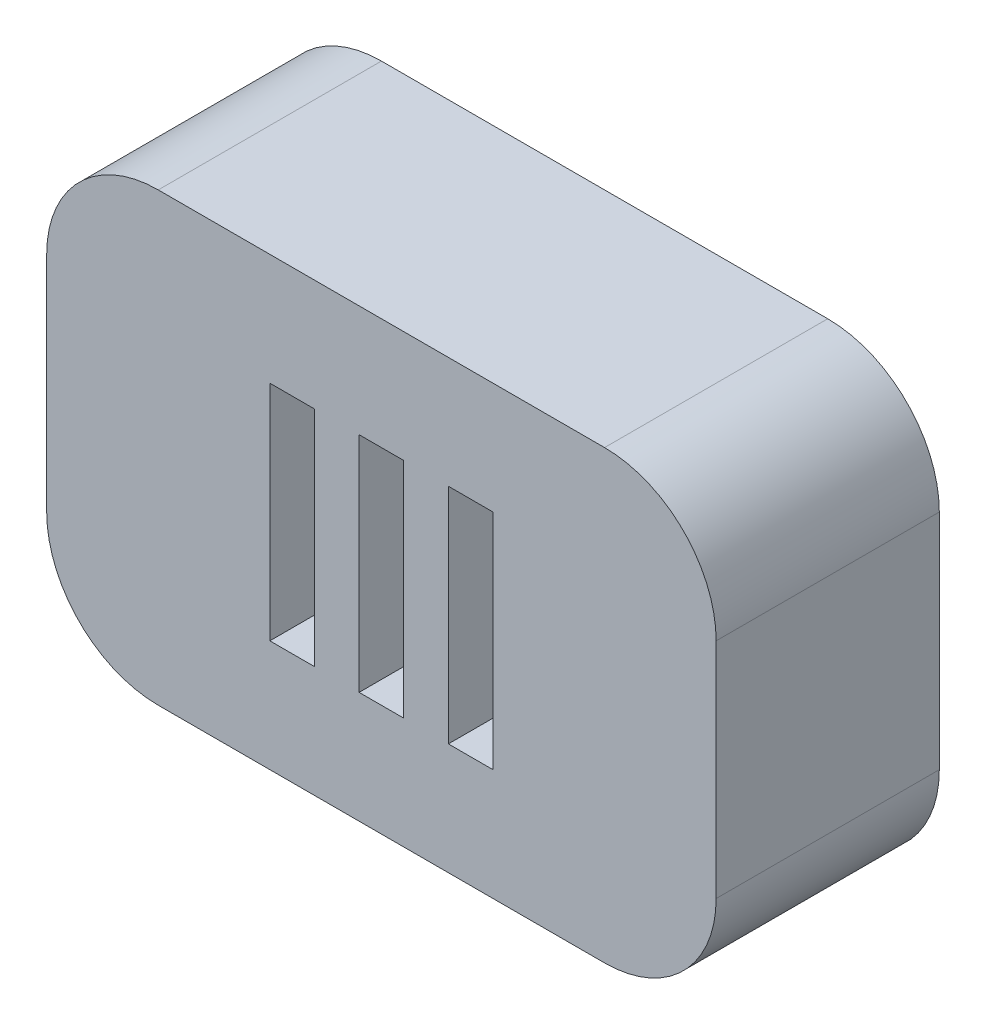
ISO-10303-21;
HEADER;
FILE_DESCRIPTION(('STEP AP214'),'2;1');
FILE_NAME('part.step','',(''),(''),'','','');
FILE_SCHEMA(('AUTOMOTIVE_DESIGN { 1 0 10303 214 1 1 1 1 }'));
ENDSEC;
DATA;
#1=APPLICATION_CONTEXT('core data for automotive mechanical design processes');
#2=APPLICATION_PROTOCOL_DEFINITION('international standard','automotive_design',2000,#1);
#3=PRODUCT_CONTEXT('',#1,'mechanical');
#4=PRODUCT('Part','Part','',(#3));
#5=PRODUCT_RELATED_PRODUCT_CATEGORY('part','',(#4));
#6=PRODUCT_DEFINITION_FORMATION('','',#4);
#7=PRODUCT_DEFINITION_CONTEXT('part definition',#1,'design');
#8=PRODUCT_DEFINITION('design','',#6,#7);
#9=PRODUCT_DEFINITION_SHAPE('','',#8);
#10=(LENGTH_UNIT() NAMED_UNIT(*) SI_UNIT(.MILLI.,.METRE.));
#11=(NAMED_UNIT(*) PLANE_ANGLE_UNIT() SI_UNIT($,.RADIAN.));
#12=(NAMED_UNIT(*) SI_UNIT($,.STERADIAN.) SOLID_ANGLE_UNIT());
#13=UNCERTAINTY_MEASURE_WITH_UNIT(LENGTH_MEASURE(1.E-05),#10,'distance_accuracy_value','');
#14=(GEOMETRIC_REPRESENTATION_CONTEXT(3) GLOBAL_UNCERTAINTY_ASSIGNED_CONTEXT((#13)) GLOBAL_UNIT_ASSIGNED_CONTEXT((#10,
#11,#12)) REPRESENTATION_CONTEXT('',''));
#15=CARTESIAN_POINT('',(0.,0.,0.));
#16=DIRECTION('',(0.,0.,1.));
#17=DIRECTION('',(1.,0.,0.));
#18=AXIS2_PLACEMENT_3D('',#15,#16,#17);
#19=CARTESIAN_POINT('',(1.,1.,2.));
#20=DIRECTION('',(0.,0.,-1.));
#21=DIRECTION('',(-1.,0.,0.));
#22=AXIS2_PLACEMENT_3D('',#19,#20,#21);
#23=CYLINDRICAL_SURFACE('',#22,1.);
#24=CARTESIAN_POINT('',(1.,1.,0.));
#25=DIRECTION('',(0.,0.,1.));
#26=DIRECTION('',(1.,0.,0.));
#27=AXIS2_PLACEMENT_3D('',#24,#25,#26);
#28=CIRCLE('',#27,1.);
#29=CARTESIAN_POINT('',(0.,1.00000000000001,0.));
#30=VERTEX_POINT('',#29);
#31=CARTESIAN_POINT('',(1.00000000000001,0.,0.));
#32=VERTEX_POINT('',#31);
#33=EDGE_CURVE('E302',#30,#32,#28,.T.);
#34=ORIENTED_EDGE('',*,*,#33,.T.);
#35=DIRECTION('',(0.,0.,-1.));
#36=VECTOR('',#35,1.);
#37=CARTESIAN_POINT('',(1.00000000000001,0.,2.));
#38=LINE('',#37,#36);
#39=CARTESIAN_POINT('',(1.00000000000001,0.,2.));
#40=VERTEX_POINT('',#39);
#41=EDGE_CURVE('E11',#40,#32,#38,.T.);
#42=ORIENTED_EDGE('',*,*,#41,.F.);
#43=CARTESIAN_POINT('',(1.,1.,2.));
#44=DIRECTION('',(0.,0.,1.));
#45=DIRECTION('',(1.,0.,0.));
#46=AXIS2_PLACEMENT_3D('',#43,#44,#45);
#47=CIRCLE('',#46,1.);
#48=CARTESIAN_POINT('',(0.,1.00000000000001,2.));
#49=VERTEX_POINT('',#48);
#50=EDGE_CURVE('E312',#49,#40,#47,.T.);
#51=ORIENTED_EDGE('',*,*,#50,.F.);
#52=DIRECTION('',(0.,0.,-1.));
#53=VECTOR('',#52,1.);
#54=CARTESIAN_POINT('',(0.,1.00000000000001,2.));
#55=LINE('',#54,#53);
#56=EDGE_CURVE('E338',#49,#30,#55,.T.);
#57=ORIENTED_EDGE('',*,*,#56,.T.);
#58=EDGE_LOOP('',(#34,#42,#51,#57));
#59=FACE_BOUND('',#58,.T.);
#60=ADVANCED_FACE('F38',(#59),#23,.T.);
#61=CARTESIAN_POINT('',(1.00000000000001,0.,2.));
#62=DIRECTION('',(0.,1.,0.));
#63=DIRECTION('',(0.,0.,1.));
#64=AXIS2_PLACEMENT_3D('',#61,#62,#63);
#65=PLANE('',#64);
#66=DIRECTION('',(1.,0.,0.));
#67=VECTOR('',#66,1.);
#68=CARTESIAN_POINT('',(1.00000000000001,0.,0.));
#69=LINE('',#68,#67);
#70=CARTESIAN_POINT('',(5.,0.,0.));
#71=VERTEX_POINT('',#70);
#72=EDGE_CURVE('E342',#32,#71,#69,.T.);
#73=ORIENTED_EDGE('',*,*,#72,.T.);
#74=DIRECTION('',(0.,0.,-1.));
#75=VECTOR('',#74,1.);
#76=CARTESIAN_POINT('',(5.,0.,2.));
#77=LINE('',#76,#75);
#78=CARTESIAN_POINT('',(5.,0.,2.));
#79=VERTEX_POINT('',#78);
#80=EDGE_CURVE('E46',#79,#71,#77,.T.);
#81=ORIENTED_EDGE('',*,*,#80,.F.);
#82=DIRECTION('',(1.,0.,0.));
#83=VECTOR('',#82,1.);
#84=CARTESIAN_POINT('',(1.00000000000001,0.,2.));
#85=LINE('',#84,#83);
#86=EDGE_CURVE('E316',#40,#79,#85,.T.);
#87=ORIENTED_EDGE('',*,*,#86,.F.);
#88=ORIENTED_EDGE('',*,*,#41,.T.);
#89=EDGE_LOOP('',(#73,#81,#87,#88));
#90=FACE_BOUND('',#89,.T.);
#91=ADVANCED_FACE('F413',(#90),#65,.F.);
#92=CARTESIAN_POINT('',(5.,1.,2.));
#93=DIRECTION('',(0.,0.,-1.));
#94=DIRECTION('',(-1.,0.,0.));
#95=AXIS2_PLACEMENT_3D('',#92,#93,#94);
#96=CYLINDRICAL_SURFACE('',#95,1.);
#97=CARTESIAN_POINT('',(5.,1.,0.));
#98=DIRECTION('',(0.,0.,1.));
#99=DIRECTION('',(1.,0.,0.));
#100=AXIS2_PLACEMENT_3D('',#97,#98,#99);
#101=CIRCLE('',#100,1.);
#102=CARTESIAN_POINT('',(6.,1.,0.));
#103=VERTEX_POINT('',#102);
#104=EDGE_CURVE('E345',#71,#103,#101,.T.);
#105=ORIENTED_EDGE('',*,*,#104,.T.);
#106=DIRECTION('',(0.,0.,-1.));
#107=VECTOR('',#106,1.);
#108=CARTESIAN_POINT('',(6.,1.,2.));
#109=LINE('',#108,#107);
#110=CARTESIAN_POINT('',(6.,1.,2.));
#111=VERTEX_POINT('',#110);
#112=EDGE_CURVE('E381',#111,#103,#109,.T.);
#113=ORIENTED_EDGE('',*,*,#112,.F.);
#114=CARTESIAN_POINT('',(5.,1.,2.));
#115=DIRECTION('',(0.,0.,1.));
#116=DIRECTION('',(1.,0.,0.));
#117=AXIS2_PLACEMENT_3D('',#114,#115,#116);
#118=CIRCLE('',#117,1.);
#119=EDGE_CURVE('E320',#79,#111,#118,.T.);
#120=ORIENTED_EDGE('',*,*,#119,.F.);
#121=ORIENTED_EDGE('',*,*,#80,.T.);
#122=EDGE_LOOP('',(#105,#113,#120,#121));
#123=FACE_BOUND('',#122,.T.);
#124=ADVANCED_FACE('F390',(#123),#96,.T.);
#125=CARTESIAN_POINT('',(6.,1.,2.));
#126=DIRECTION('',(-1.,0.,0.));
#127=DIRECTION('',(0.,0.,1.));
#128=AXIS2_PLACEMENT_3D('',#125,#126,#127);
#129=PLANE('',#128);
#130=DIRECTION('',(0.,1.,0.));
#131=VECTOR('',#130,1.);
#132=CARTESIAN_POINT('',(6.,1.,0.));
#133=LINE('',#132,#131);
#134=CARTESIAN_POINT('',(6.,3.,0.));
#135=VERTEX_POINT('',#134);
#136=EDGE_CURVE('E348',#103,#135,#133,.T.);
#137=ORIENTED_EDGE('',*,*,#136,.T.);
#138=DIRECTION('',(0.,0.,-1.));
#139=VECTOR('',#138,1.);
#140=CARTESIAN_POINT('',(6.,3.,2.));
#141=LINE('',#140,#139);
#142=CARTESIAN_POINT('',(6.,3.,2.));
#143=VERTEX_POINT('',#142);
#144=EDGE_CURVE('E377',#143,#135,#141,.T.);
#145=ORIENTED_EDGE('',*,*,#144,.F.);
#146=DIRECTION('',(0.,1.,0.));
#147=VECTOR('',#146,1.);
#148=CARTESIAN_POINT('',(6.,1.,2.));
#149=LINE('',#148,#147);
#150=EDGE_CURVE('E323',#111,#143,#149,.T.);
#151=ORIENTED_EDGE('',*,*,#150,.F.);
#152=ORIENTED_EDGE('',*,*,#112,.T.);
#153=EDGE_LOOP('',(#137,#145,#151,#152));
#154=FACE_BOUND('',#153,.T.);
#155=ADVANCED_FACE('F401',(#154),#129,.F.);
#156=CARTESIAN_POINT('',(5.,3.,2.));
#157=DIRECTION('',(0.,0.,-1.));
#158=DIRECTION('',(-1.,0.,0.));
#159=AXIS2_PLACEMENT_3D('',#156,#157,#158);
#160=CYLINDRICAL_SURFACE('',#159,1.);
#161=CARTESIAN_POINT('',(5.,3.,0.));
#162=DIRECTION('',(0.,0.,1.));
#163=DIRECTION('',(1.,0.,0.));
#164=AXIS2_PLACEMENT_3D('',#161,#162,#163);
#165=CIRCLE('',#164,1.);
#166=CARTESIAN_POINT('',(5.,4.,0.));
#167=VERTEX_POINT('',#166);
#168=EDGE_CURVE('E351',#135,#167,#165,.T.);
#169=ORIENTED_EDGE('',*,*,#168,.T.);
#170=DIRECTION('',(0.,0.,-1.));
#171=VECTOR('',#170,1.);
#172=CARTESIAN_POINT('',(5.,4.,2.));
#173=LINE('',#172,#171);
#174=CARTESIAN_POINT('',(5.,4.,2.));
#175=VERTEX_POINT('',#174);
#176=EDGE_CURVE('E373',#175,#167,#173,.T.);
#177=ORIENTED_EDGE('',*,*,#176,.F.);
#178=CARTESIAN_POINT('',(5.,3.,2.));
#179=DIRECTION('',(0.,0.,1.));
#180=DIRECTION('',(1.,0.,0.));
#181=AXIS2_PLACEMENT_3D('',#178,#179,#180);
#182=CIRCLE('',#181,1.);
#183=EDGE_CURVE('E326',#143,#175,#182,.T.);
#184=ORIENTED_EDGE('',*,*,#183,.F.);
#185=ORIENTED_EDGE('',*,*,#144,.T.);
#186=EDGE_LOOP('',(#169,#177,#184,#185));
#187=FACE_BOUND('',#186,.T.);
#188=ADVANCED_FACE('F405',(#187),#160,.T.);
#189=CARTESIAN_POINT('',(1.00000000000001,4.,2.));
#190=DIRECTION('',(0.,-1.,0.));
#191=DIRECTION('',(0.,0.,-1.));
#192=AXIS2_PLACEMENT_3D('',#189,#190,#191);
#193=PLANE('',#192);
#194=DIRECTION('',(-1.,0.,0.));
#195=VECTOR('',#194,1.);
#196=CARTESIAN_POINT('',(1.00000000000001,4.,0.));
#197=LINE('',#196,#195);
#198=CARTESIAN_POINT('',(1.00000000000001,4.,0.));
#199=VERTEX_POINT('',#198);
#200=EDGE_CURVE('E354',#167,#199,#197,.T.);
#201=ORIENTED_EDGE('',*,*,#200,.T.);
#202=DIRECTION('',(0.,0.,-1.));
#203=VECTOR('',#202,1.);
#204=CARTESIAN_POINT('',(1.00000000000001,4.,2.));
#205=LINE('',#204,#203);
#206=CARTESIAN_POINT('',(1.00000000000001,4.,2.));
#207=VERTEX_POINT('',#206);
#208=EDGE_CURVE('E369',#207,#199,#205,.T.);
#209=ORIENTED_EDGE('',*,*,#208,.F.);
#210=DIRECTION('',(-1.,0.,0.));
#211=VECTOR('',#210,1.);
#212=CARTESIAN_POINT('',(1.00000000000001,4.,2.));
#213=LINE('',#212,#211);
#214=EDGE_CURVE('E329',#175,#207,#213,.T.);
#215=ORIENTED_EDGE('',*,*,#214,.F.);
#216=ORIENTED_EDGE('',*,*,#176,.T.);
#217=EDGE_LOOP('',(#201,#209,#215,#216));
#218=FACE_BOUND('',#217,.T.);
#219=ADVANCED_FACE('F426',(#218),#193,.F.);
#220=CARTESIAN_POINT('',(1.,3.,2.));
#221=DIRECTION('',(0.,0.,-1.));
#222=DIRECTION('',(-1.,0.,0.));
#223=AXIS2_PLACEMENT_3D('',#220,#221,#222);
#224=CYLINDRICAL_SURFACE('',#223,1.);
#225=CARTESIAN_POINT('',(1.,3.,0.));
#226=DIRECTION('',(0.,0.,1.));
#227=DIRECTION('',(1.,0.,0.));
#228=AXIS2_PLACEMENT_3D('',#225,#226,#227);
#229=CIRCLE('',#228,1.);
#230=CARTESIAN_POINT('',(0.,2.99999999999999,0.));
#231=VERTEX_POINT('',#230);
#232=EDGE_CURVE('E357',#199,#231,#229,.T.);
#233=ORIENTED_EDGE('',*,*,#232,.T.);
#234=DIRECTION('',(0.,0.,-1.));
#235=VECTOR('',#234,1.);
#236=CARTESIAN_POINT('',(0.,2.99999999999999,2.));
#237=LINE('',#236,#235);
#238=CARTESIAN_POINT('',(0.,2.99999999999999,2.));
#239=VERTEX_POINT('',#238);
#240=EDGE_CURVE('E365',#239,#231,#237,.T.);
#241=ORIENTED_EDGE('',*,*,#240,.F.);
#242=CARTESIAN_POINT('',(1.,3.,2.));
#243=DIRECTION('',(0.,0.,1.));
#244=DIRECTION('',(1.,0.,0.));
#245=AXIS2_PLACEMENT_3D('',#242,#243,#244);
#246=CIRCLE('',#245,1.);
#247=EDGE_CURVE('E332',#207,#239,#246,.T.);
#248=ORIENTED_EDGE('',*,*,#247,.F.);
#249=ORIENTED_EDGE('',*,*,#208,.T.);
#250=EDGE_LOOP('',(#233,#241,#248,#249));
#251=FACE_BOUND('',#250,.T.);
#252=ADVANCED_FACE('F424',(#251),#224,.T.);
#253=CARTESIAN_POINT('',(0.,1.00000000000001,2.));
#254=DIRECTION('',(1.,0.,0.));
#255=DIRECTION('',(0.,0.,-1.));
#256=AXIS2_PLACEMENT_3D('',#253,#254,#255);
#257=PLANE('',#256);
#258=DIRECTION('',(0.,-1.,0.));
#259=VECTOR('',#258,1.);
#260=CARTESIAN_POINT('',(0.,1.00000000000001,0.));
#261=LINE('',#260,#259);
#262=EDGE_CURVE('E317',#231,#30,#261,.T.);
#263=ORIENTED_EDGE('',*,*,#262,.T.);
#264=ORIENTED_EDGE('',*,*,#56,.F.);
#265=DIRECTION('',(0.,-1.,0.));
#266=VECTOR('',#265,1.);
#267=CARTESIAN_POINT('',(0.,1.00000000000001,2.));
#268=LINE('',#267,#266);
#269=EDGE_CURVE('E335',#239,#49,#268,.T.);
#270=ORIENTED_EDGE('',*,*,#269,.F.);
#271=ORIENTED_EDGE('',*,*,#240,.T.);
#272=EDGE_LOOP('',(#263,#264,#270,#271));
#273=FACE_BOUND('',#272,.T.);
#274=ADVANCED_FACE('F419',(#273),#257,.F.);
#275=CARTESIAN_POINT('',(1.,1.,2.));
#276=DIRECTION('',(0.,0.,1.));
#277=DIRECTION('',(1.,0.,0.));
#278=AXIS2_PLACEMENT_3D('',#275,#276,#277);
#279=PLANE('',#278);
#280=DIRECTION('',(0.,1.,0.));
#281=VECTOR('',#280,1.);
#282=CARTESIAN_POINT('',(2.4,3.,2.));
#283=LINE('',#282,#281);
#284=CARTESIAN_POINT('',(2.4,1.,2.));
#285=VERTEX_POINT('',#284);
#286=CARTESIAN_POINT('',(2.4,3.,2.));
#287=VERTEX_POINT('',#286);
#288=EDGE_CURVE('E53',#285,#287,#283,.T.);
#289=ORIENTED_EDGE('',*,*,#288,.F.);
#290=DIRECTION('',(1.,0.,0.));
#291=VECTOR('',#290,1.);
#292=CARTESIAN_POINT('',(2.4,1.,2.));
#293=LINE('',#292,#291);
#294=CARTESIAN_POINT('',(2.,1.,2.));
#295=VERTEX_POINT('',#294);
#296=EDGE_CURVE('E198',#295,#285,#293,.T.);
#297=ORIENTED_EDGE('',*,*,#296,.F.);
#298=DIRECTION('',(0.,-1.,0.));
#299=VECTOR('',#298,1.);
#300=CARTESIAN_POINT('',(2.,3.,2.));
#301=LINE('',#300,#299);
#302=CARTESIAN_POINT('',(2.,3.,2.));
#303=VERTEX_POINT('',#302);
#304=EDGE_CURVE('E202',#303,#295,#301,.T.);
#305=ORIENTED_EDGE('',*,*,#304,.F.);
#306=DIRECTION('',(-1.,0.,0.));
#307=VECTOR('',#306,1.);
#308=CARTESIAN_POINT('',(2.4,3.,2.));
#309=LINE('',#308,#307);
#310=EDGE_CURVE('E211',#287,#303,#309,.T.);
#311=ORIENTED_EDGE('',*,*,#310,.F.);
#312=EDGE_LOOP('',(#289,#297,#305,#311));
#313=FACE_BOUND('',#312,.T.);
#314=DIRECTION('',(0.,-1.,0.));
#315=VECTOR('',#314,1.);
#316=CARTESIAN_POINT('',(3.6,3.,2.));
#317=LINE('',#316,#315);
#318=CARTESIAN_POINT('',(3.6,3.,2.));
#319=VERTEX_POINT('',#318);
#320=CARTESIAN_POINT('',(3.6,1.,2.));
#321=VERTEX_POINT('',#320);
#322=EDGE_CURVE('E61',#319,#321,#317,.T.);
#323=ORIENTED_EDGE('',*,*,#322,.F.);
#324=DIRECTION('',(-1.,0.,0.));
#325=VECTOR('',#324,1.);
#326=CARTESIAN_POINT('',(3.6,3.,2.));
#327=LINE('',#326,#325);
#328=CARTESIAN_POINT('',(4.,3.,2.));
#329=VERTEX_POINT('',#328);
#330=EDGE_CURVE('E230',#329,#319,#327,.T.);
#331=ORIENTED_EDGE('',*,*,#330,.F.);
#332=DIRECTION('',(0.,1.,0.));
#333=VECTOR('',#332,1.);
#334=CARTESIAN_POINT('',(4.,3.,2.));
#335=LINE('',#334,#333);
#336=CARTESIAN_POINT('',(4.,1.,2.));
#337=VERTEX_POINT('',#336);
#338=EDGE_CURVE('E249',#337,#329,#335,.T.);
#339=ORIENTED_EDGE('',*,*,#338,.F.);
#340=DIRECTION('',(1.,0.,0.));
#341=VECTOR('',#340,1.);
#342=CARTESIAN_POINT('',(3.6,1.,2.));
#343=LINE('',#342,#341);
#344=EDGE_CURVE('E245',#321,#337,#343,.T.);
#345=ORIENTED_EDGE('',*,*,#344,.F.);
#346=EDGE_LOOP('',(#323,#331,#339,#345));
#347=FACE_BOUND('',#346,.T.);
#348=DIRECTION('',(0.,-1.,0.));
#349=VECTOR('',#348,1.);
#350=CARTESIAN_POINT('',(2.8,3.,2.));
#351=LINE('',#350,#349);
#352=CARTESIAN_POINT('',(2.8,3.,2.));
#353=VERTEX_POINT('',#352);
#354=CARTESIAN_POINT('',(2.8,1.,2.));
#355=VERTEX_POINT('',#354);
#356=EDGE_CURVE('E259',#353,#355,#351,.T.);
#357=ORIENTED_EDGE('',*,*,#356,.F.);
#358=DIRECTION('',(-1.,0.,0.));
#359=VECTOR('',#358,1.);
#360=CARTESIAN_POINT('',(2.8,3.,2.));
#361=LINE('',#360,#359);
#362=CARTESIAN_POINT('',(3.2,3.,2.));
#363=VERTEX_POINT('',#362);
#364=EDGE_CURVE('E273',#363,#353,#361,.T.);
#365=ORIENTED_EDGE('',*,*,#364,.F.);
#366=DIRECTION('',(0.,1.,0.));
#367=VECTOR('',#366,1.);
#368=CARTESIAN_POINT('',(3.2,3.,2.));
#369=LINE('',#368,#367);
#370=CARTESIAN_POINT('',(3.2,1.,2.));
#371=VERTEX_POINT('',#370);
#372=EDGE_CURVE('E292',#371,#363,#369,.T.);
#373=ORIENTED_EDGE('',*,*,#372,.F.);
#374=DIRECTION('',(1.,0.,0.));
#375=VECTOR('',#374,1.);
#376=CARTESIAN_POINT('',(2.8,1.,2.));
#377=LINE('',#376,#375);
#378=EDGE_CURVE('E288',#355,#371,#377,.T.);
#379=ORIENTED_EDGE('',*,*,#378,.F.);
#380=EDGE_LOOP('',(#357,#365,#373,#379));
#381=FACE_BOUND('',#380,.T.);
#382=ORIENTED_EDGE('',*,*,#50,.T.);
#383=ORIENTED_EDGE('',*,*,#86,.T.);
#384=ORIENTED_EDGE('',*,*,#119,.T.);
#385=ORIENTED_EDGE('',*,*,#150,.T.);
#386=ORIENTED_EDGE('',*,*,#183,.T.);
#387=ORIENTED_EDGE('',*,*,#214,.T.);
#388=ORIENTED_EDGE('',*,*,#247,.T.);
#389=ORIENTED_EDGE('',*,*,#269,.T.);
#390=EDGE_LOOP('',(#382,#383,#384,#385,#386,#387,#388,#389));
#391=FACE_BOUND('',#390,.T.);
#392=ADVANCED_FACE('F409',(#313,#347,#381,#391),#279,.T.);
#393=CARTESIAN_POINT('',(1.,1.,0.));
#394=DIRECTION('',(0.,0.,1.));
#395=DIRECTION('',(1.,0.,0.));
#396=AXIS2_PLACEMENT_3D('',#393,#394,#395);
#397=PLANE('',#396);
#398=ORIENTED_EDGE('',*,*,#33,.F.);
#399=ORIENTED_EDGE('',*,*,#262,.F.);
#400=ORIENTED_EDGE('',*,*,#232,.F.);
#401=ORIENTED_EDGE('',*,*,#200,.F.);
#402=ORIENTED_EDGE('',*,*,#168,.F.);
#403=ORIENTED_EDGE('',*,*,#136,.F.);
#404=ORIENTED_EDGE('',*,*,#104,.F.);
#405=ORIENTED_EDGE('',*,*,#72,.F.);
#406=EDGE_LOOP('',(#398,#399,#400,#401,#402,#403,#404,#405));
#407=FACE_BOUND('',#406,.T.);
#408=ADVANCED_FACE('F396',(#407),#397,.F.);
#409=CARTESIAN_POINT('',(2.8,3.,1.));
#410=DIRECTION('',(-1.,0.,0.));
#411=DIRECTION('',(0.,-1.,0.));
#412=AXIS2_PLACEMENT_3D('',#409,#410,#411);
#413=PLANE('',#412);
#414=ORIENTED_EDGE('',*,*,#356,.T.);
#415=DIRECTION('',(0.,0.,1.));
#416=VECTOR('',#415,1.);
#417=CARTESIAN_POINT('',(2.8,1.,1.));
#418=LINE('',#417,#416);
#419=CARTESIAN_POINT('',(2.8,1.,1.));
#420=VERTEX_POINT('',#419);
#421=EDGE_CURVE('E285',#420,#355,#418,.T.);
#422=ORIENTED_EDGE('',*,*,#421,.F.);
#423=DIRECTION('',(0.,-1.,0.));
#424=VECTOR('',#423,1.);
#425=CARTESIAN_POINT('',(2.8,3.,1.));
#426=LINE('',#425,#424);
#427=CARTESIAN_POINT('',(2.8,3.,1.));
#428=VERTEX_POINT('',#427);
#429=EDGE_CURVE('E268',#428,#420,#426,.T.);
#430=ORIENTED_EDGE('',*,*,#429,.F.);
#431=DIRECTION('',(0.,0.,1.));
#432=VECTOR('',#431,1.);
#433=CARTESIAN_POINT('',(2.8,3.,1.));
#434=LINE('',#433,#432);
#435=EDGE_CURVE('E299',#428,#353,#434,.T.);
#436=ORIENTED_EDGE('',*,*,#435,.T.);
#437=EDGE_LOOP('',(#414,#422,#430,#436));
#438=FACE_BOUND('',#437,.T.);
#439=ADVANCED_FACE('F482',(#438),#413,.F.);
#440=CARTESIAN_POINT('',(2.8,3.,1.));
#441=DIRECTION('',(0.,1.,0.));
#442=DIRECTION('',(0.,0.,1.));
#443=AXIS2_PLACEMENT_3D('',#440,#441,#442);
#444=PLANE('',#443);
#445=ORIENTED_EDGE('',*,*,#364,.T.);
#446=ORIENTED_EDGE('',*,*,#435,.F.);
#447=DIRECTION('',(-1.,0.,0.));
#448=VECTOR('',#447,1.);
#449=CARTESIAN_POINT('',(2.8,3.,1.));
#450=LINE('',#449,#448);
#451=CARTESIAN_POINT('',(3.2,3.,1.));
#452=VERTEX_POINT('',#451);
#453=EDGE_CURVE('E281',#452,#428,#450,.T.);
#454=ORIENTED_EDGE('',*,*,#453,.F.);
#455=DIRECTION('',(0.,0.,1.));
#456=VECTOR('',#455,1.);
#457=CARTESIAN_POINT('',(3.2,3.,1.));
#458=LINE('',#457,#456);
#459=EDGE_CURVE('E303',#452,#363,#458,.T.);
#460=ORIENTED_EDGE('',*,*,#459,.T.);
#461=EDGE_LOOP('',(#445,#446,#454,#460));
#462=FACE_BOUND('',#461,.T.);
#463=ADVANCED_FACE('F491',(#462),#444,.F.);
#464=CARTESIAN_POINT('',(3.2,3.,1.));
#465=DIRECTION('',(1.,0.,0.));
#466=DIRECTION('',(0.,1.,0.));
#467=AXIS2_PLACEMENT_3D('',#464,#465,#466);
#468=PLANE('',#467);
#469=ORIENTED_EDGE('',*,*,#372,.T.);
#470=ORIENTED_EDGE('',*,*,#459,.F.);
#471=DIRECTION('',(0.,1.,0.));
#472=VECTOR('',#471,1.);
#473=CARTESIAN_POINT('',(3.2,3.,1.));
#474=LINE('',#473,#472);
#475=CARTESIAN_POINT('',(3.2,1.,1.));
#476=VERTEX_POINT('',#475);
#477=EDGE_CURVE('E277',#476,#452,#474,.T.);
#478=ORIENTED_EDGE('',*,*,#477,.F.);
#479=DIRECTION('',(0.,0.,1.));
#480=VECTOR('',#479,1.);
#481=CARTESIAN_POINT('',(3.2,1.,1.));
#482=LINE('',#481,#480);
#483=EDGE_CURVE('E306',#476,#371,#482,.T.);
#484=ORIENTED_EDGE('',*,*,#483,.T.);
#485=EDGE_LOOP('',(#469,#470,#478,#484));
#486=FACE_BOUND('',#485,.T.);
#487=ADVANCED_FACE('F501',(#486),#468,.F.);
#488=CARTESIAN_POINT('',(2.8,1.,1.));
#489=DIRECTION('',(0.,-1.,0.));
#490=DIRECTION('',(0.,0.,-1.));
#491=AXIS2_PLACEMENT_3D('',#488,#489,#490);
#492=PLANE('',#491);
#493=ORIENTED_EDGE('',*,*,#378,.T.);
#494=ORIENTED_EDGE('',*,*,#483,.F.);
#495=DIRECTION('',(1.,0.,0.));
#496=VECTOR('',#495,1.);
#497=CARTESIAN_POINT('',(2.8,1.,1.));
#498=LINE('',#497,#496);
#499=EDGE_CURVE('E272',#420,#476,#498,.T.);
#500=ORIENTED_EDGE('',*,*,#499,.F.);
#501=ORIENTED_EDGE('',*,*,#421,.T.);
#502=EDGE_LOOP('',(#493,#494,#500,#501));
#503=FACE_BOUND('',#502,.T.);
#504=ADVANCED_FACE('F511',(#503),#492,.F.);
#505=CARTESIAN_POINT('',(0.,0.,1.));
#506=DIRECTION('',(0.,0.,1.));
#507=DIRECTION('',(1.,0.,0.));
#508=AXIS2_PLACEMENT_3D('',#505,#506,#507);
#509=PLANE('',#508);
#510=ORIENTED_EDGE('',*,*,#429,.T.);
#511=ORIENTED_EDGE('',*,*,#499,.T.);
#512=ORIENTED_EDGE('',*,*,#477,.T.);
#513=ORIENTED_EDGE('',*,*,#453,.T.);
#514=EDGE_LOOP('',(#510,#511,#512,#513));
#515=FACE_BOUND('',#514,.T.);
#516=ADVANCED_FACE('F521',(#515),#509,.T.);
#517=CARTESIAN_POINT('',(3.6,3.,1.));
#518=DIRECTION('',(-1.,0.,0.));
#519=DIRECTION('',(0.,-1.,0.));
#520=AXIS2_PLACEMENT_3D('',#517,#518,#519);
#521=PLANE('',#520);
#522=ORIENTED_EDGE('',*,*,#322,.T.);
#523=DIRECTION('',(0.,0.,1.));
#524=VECTOR('',#523,1.);
#525=CARTESIAN_POINT('',(3.6,1.,1.));
#526=LINE('',#525,#524);
#527=CARTESIAN_POINT('',(3.6,1.,1.));
#528=VERTEX_POINT('',#527);
#529=EDGE_CURVE('E242',#528,#321,#526,.T.);
#530=ORIENTED_EDGE('',*,*,#529,.F.);
#531=DIRECTION('',(0.,-1.,0.));
#532=VECTOR('',#531,1.);
#533=CARTESIAN_POINT('',(3.6,3.,1.));
#534=LINE('',#533,#532);
#535=CARTESIAN_POINT('',(3.6,3.,1.));
#536=VERTEX_POINT('',#535);
#537=EDGE_CURVE('E225',#536,#528,#534,.T.);
#538=ORIENTED_EDGE('',*,*,#537,.F.);
#539=DIRECTION('',(0.,0.,1.));
#540=VECTOR('',#539,1.);
#541=CARTESIAN_POINT('',(3.6,3.,1.));
#542=LINE('',#541,#540);
#543=EDGE_CURVE('E256',#536,#319,#542,.T.);
#544=ORIENTED_EDGE('',*,*,#543,.T.);
#545=EDGE_LOOP('',(#522,#530,#538,#544));
#546=FACE_BOUND('',#545,.T.);
#547=ADVANCED_FACE('F531',(#546),#521,.F.);
#548=CARTESIAN_POINT('',(3.6,3.,1.));
#549=DIRECTION('',(0.,1.,0.));
#550=DIRECTION('',(0.,0.,1.));
#551=AXIS2_PLACEMENT_3D('',#548,#549,#550);
#552=PLANE('',#551);
#553=ORIENTED_EDGE('',*,*,#330,.T.);
#554=ORIENTED_EDGE('',*,*,#543,.F.);
#555=DIRECTION('',(-1.,0.,0.));
#556=VECTOR('',#555,1.);
#557=CARTESIAN_POINT('',(3.6,3.,1.));
#558=LINE('',#557,#556);
#559=CARTESIAN_POINT('',(4.,3.,1.));
#560=VERTEX_POINT('',#559);
#561=EDGE_CURVE('E238',#560,#536,#558,.T.);
#562=ORIENTED_EDGE('',*,*,#561,.F.);
#563=DIRECTION('',(0.,0.,1.));
#564=VECTOR('',#563,1.);
#565=CARTESIAN_POINT('',(4.,3.,1.));
#566=LINE('',#565,#564);
#567=EDGE_CURVE('E260',#560,#329,#566,.T.);
#568=ORIENTED_EDGE('',*,*,#567,.T.);
#569=EDGE_LOOP('',(#553,#554,#562,#568));
#570=FACE_BOUND('',#569,.T.);
#571=ADVANCED_FACE('F541',(#570),#552,.F.);
#572=CARTESIAN_POINT('',(4.,3.,1.));
#573=DIRECTION('',(1.,0.,0.));
#574=DIRECTION('',(0.,0.,-1.));
#575=AXIS2_PLACEMENT_3D('',#572,#573,#574);
#576=PLANE('',#575);
#577=ORIENTED_EDGE('',*,*,#338,.T.);
#578=ORIENTED_EDGE('',*,*,#567,.F.);
#579=DIRECTION('',(0.,1.,0.));
#580=VECTOR('',#579,1.);
#581=CARTESIAN_POINT('',(4.,3.,1.));
#582=LINE('',#581,#580);
#583=CARTESIAN_POINT('',(4.,1.,1.));
#584=VERTEX_POINT('',#583);
#585=EDGE_CURVE('E234',#584,#560,#582,.T.);
#586=ORIENTED_EDGE('',*,*,#585,.F.);
#587=DIRECTION('',(0.,0.,1.));
#588=VECTOR('',#587,1.);
#589=CARTESIAN_POINT('',(4.,1.,1.));
#590=LINE('',#589,#588);
#591=EDGE_CURVE('E263',#584,#337,#590,.T.);
#592=ORIENTED_EDGE('',*,*,#591,.T.);
#593=EDGE_LOOP('',(#577,#578,#586,#592));
#594=FACE_BOUND('',#593,.T.);
#595=ADVANCED_FACE('F550',(#594),#576,.F.);
#596=CARTESIAN_POINT('',(3.6,1.,1.));
#597=DIRECTION('',(0.,-1.,0.));
#598=DIRECTION('',(0.,0.,-1.));
#599=AXIS2_PLACEMENT_3D('',#596,#597,#598);
#600=PLANE('',#599);
#601=ORIENTED_EDGE('',*,*,#344,.T.);
#602=ORIENTED_EDGE('',*,*,#591,.F.);
#603=DIRECTION('',(1.,0.,0.));
#604=VECTOR('',#603,1.);
#605=CARTESIAN_POINT('',(3.6,1.,1.));
#606=LINE('',#605,#604);
#607=EDGE_CURVE('E229',#528,#584,#606,.T.);
#608=ORIENTED_EDGE('',*,*,#607,.F.);
#609=ORIENTED_EDGE('',*,*,#529,.T.);
#610=EDGE_LOOP('',(#601,#602,#608,#609));
#611=FACE_BOUND('',#610,.T.);
#612=ADVANCED_FACE('F560',(#611),#600,.F.);
#613=CARTESIAN_POINT('',(0.,0.,1.));
#614=DIRECTION('',(0.,0.,1.));
#615=DIRECTION('',(1.,0.,0.));
#616=AXIS2_PLACEMENT_3D('',#613,#614,#615);
#617=PLANE('',#616);
#618=ORIENTED_EDGE('',*,*,#537,.T.);
#619=ORIENTED_EDGE('',*,*,#607,.T.);
#620=ORIENTED_EDGE('',*,*,#585,.T.);
#621=ORIENTED_EDGE('',*,*,#561,.T.);
#622=EDGE_LOOP('',(#618,#619,#620,#621));
#623=FACE_BOUND('',#622,.T.);
#624=ADVANCED_FACE('F570',(#623),#617,.T.);
#625=CARTESIAN_POINT('',(2.4,3.,1.));
#626=DIRECTION('',(1.,0.,0.));
#627=DIRECTION('',(0.,1.,0.));
#628=AXIS2_PLACEMENT_3D('',#625,#626,#627);
#629=PLANE('',#628);
#630=ORIENTED_EDGE('',*,*,#288,.T.);
#631=DIRECTION('',(0.,0.,1.));
#632=VECTOR('',#631,1.);
#633=CARTESIAN_POINT('',(2.4,3.,1.));
#634=LINE('',#633,#632);
#635=CARTESIAN_POINT('',(2.4,3.,1.));
#636=VERTEX_POINT('',#635);
#637=EDGE_CURVE('E173',#636,#287,#634,.T.);
#638=ORIENTED_EDGE('',*,*,#637,.F.);
#639=DIRECTION('',(0.,1.,0.));
#640=VECTOR('',#639,1.);
#641=CARTESIAN_POINT('',(2.4,3.,1.));
#642=LINE('',#641,#640);
#643=CARTESIAN_POINT('',(2.4,1.,1.));
#644=VERTEX_POINT('',#643);
#645=EDGE_CURVE('E177',#644,#636,#642,.T.);
#646=ORIENTED_EDGE('',*,*,#645,.F.);
#647=DIRECTION('',(0.,0.,1.));
#648=VECTOR('',#647,1.);
#649=CARTESIAN_POINT('',(2.4,1.,1.));
#650=LINE('',#649,#648);
#651=EDGE_CURVE('E217',#644,#285,#650,.T.);
#652=ORIENTED_EDGE('',*,*,#651,.T.);
#653=EDGE_LOOP('',(#630,#638,#646,#652));
#654=FACE_BOUND('',#653,.T.);
#655=ADVANCED_FACE('F175',(#654),#629,.F.);
#656=CARTESIAN_POINT('',(2.4,1.,1.));
#657=DIRECTION('',(0.,-1.,0.));
#658=DIRECTION('',(0.,0.,-1.));
#659=AXIS2_PLACEMENT_3D('',#656,#657,#658);
#660=PLANE('',#659);
#661=ORIENTED_EDGE('',*,*,#296,.T.);
#662=ORIENTED_EDGE('',*,*,#651,.F.);
#663=DIRECTION('',(1.,0.,0.));
#664=VECTOR('',#663,1.);
#665=CARTESIAN_POINT('',(2.4,1.,1.));
#666=LINE('',#665,#664);
#667=CARTESIAN_POINT('',(2.,1.,1.));
#668=VERTEX_POINT('',#667);
#669=EDGE_CURVE('E184',#668,#644,#666,.T.);
#670=ORIENTED_EDGE('',*,*,#669,.F.);
#671=DIRECTION('',(0.,0.,1.));
#672=VECTOR('',#671,1.);
#673=CARTESIAN_POINT('',(2.,1.,1.));
#674=LINE('',#673,#672);
#675=EDGE_CURVE('E220',#668,#295,#674,.T.);
#676=ORIENTED_EDGE('',*,*,#675,.T.);
#677=EDGE_LOOP('',(#661,#662,#670,#676));
#678=FACE_BOUND('',#677,.T.);
#679=ADVANCED_FACE('F594',(#678),#660,.F.);
#680=CARTESIAN_POINT('',(2.,3.,1.));
#681=DIRECTION('',(-1.,0.,0.));
#682=DIRECTION('',(0.,-1.,0.));
#683=AXIS2_PLACEMENT_3D('',#680,#681,#682);
#684=PLANE('',#683);
#685=ORIENTED_EDGE('',*,*,#304,.T.);
#686=ORIENTED_EDGE('',*,*,#675,.F.);
#687=DIRECTION('',(0.,-1.,0.));
#688=VECTOR('',#687,1.);
#689=CARTESIAN_POINT('',(2.,3.,1.));
#690=LINE('',#689,#688);
#691=CARTESIAN_POINT('',(2.,3.,1.));
#692=VERTEX_POINT('',#691);
#693=EDGE_CURVE('E193',#692,#668,#690,.T.);
#694=ORIENTED_EDGE('',*,*,#693,.F.);
#695=DIRECTION('',(0.,0.,1.));
#696=VECTOR('',#695,1.);
#697=CARTESIAN_POINT('',(2.,3.,1.));
#698=LINE('',#697,#696);
#699=EDGE_CURVE('E183',#692,#303,#698,.T.);
#700=ORIENTED_EDGE('',*,*,#699,.T.);
#701=EDGE_LOOP('',(#685,#686,#694,#700));
#702=FACE_BOUND('',#701,.T.);
#703=ADVANCED_FACE('F603',(#702),#684,.F.);
#704=CARTESIAN_POINT('',(2.4,3.,1.));
#705=DIRECTION('',(0.,1.,0.));
#706=DIRECTION('',(0.,0.,1.));
#707=AXIS2_PLACEMENT_3D('',#704,#705,#706);
#708=PLANE('',#707);
#709=ORIENTED_EDGE('',*,*,#310,.T.);
#710=ORIENTED_EDGE('',*,*,#699,.F.);
#711=DIRECTION('',(-1.,0.,0.));
#712=VECTOR('',#711,1.);
#713=CARTESIAN_POINT('',(2.4,3.,1.));
#714=LINE('',#713,#712);
#715=EDGE_CURVE('E187',#636,#692,#714,.T.);
#716=ORIENTED_EDGE('',*,*,#715,.F.);
#717=ORIENTED_EDGE('',*,*,#637,.T.);
#718=EDGE_LOOP('',(#709,#710,#716,#717));
#719=FACE_BOUND('',#718,.T.);
#720=ADVANCED_FACE('F188',(#719),#708,.F.);
#721=CARTESIAN_POINT('',(0.,0.,1.));
#722=DIRECTION('',(0.,0.,-1.));
#723=DIRECTION('',(-1.,0.,0.));
#724=AXIS2_PLACEMENT_3D('',#721,#722,#723);
#725=PLANE('',#724);
#726=ORIENTED_EDGE('',*,*,#645,.T.);
#727=ORIENTED_EDGE('',*,*,#715,.T.);
#728=ORIENTED_EDGE('',*,*,#693,.T.);
#729=ORIENTED_EDGE('',*,*,#669,.T.);
#730=EDGE_LOOP('',(#726,#727,#728,#729));
#731=FACE_BOUND('',#730,.T.);
#732=ADVANCED_FACE('F195',(#731),#725,.F.);
#733=CLOSED_SHELL('',(#60,#91,#124,#155,#188,#219,#252,#274,#392,#408,#439,#463,#487,#504,#516,
#547,#571,#595,#612,#624,#655,#679,#703,#720,#732));
#734=MANIFOLD_SOLID_BREP('B2',#733);
#735=ADVANCED_BREP_SHAPE_REPRESENTATION('',(#18,#734),#14);
#736=SHAPE_DEFINITION_REPRESENTATION(#9,#735);
ENDSEC;
END-ISO-10303-21;
